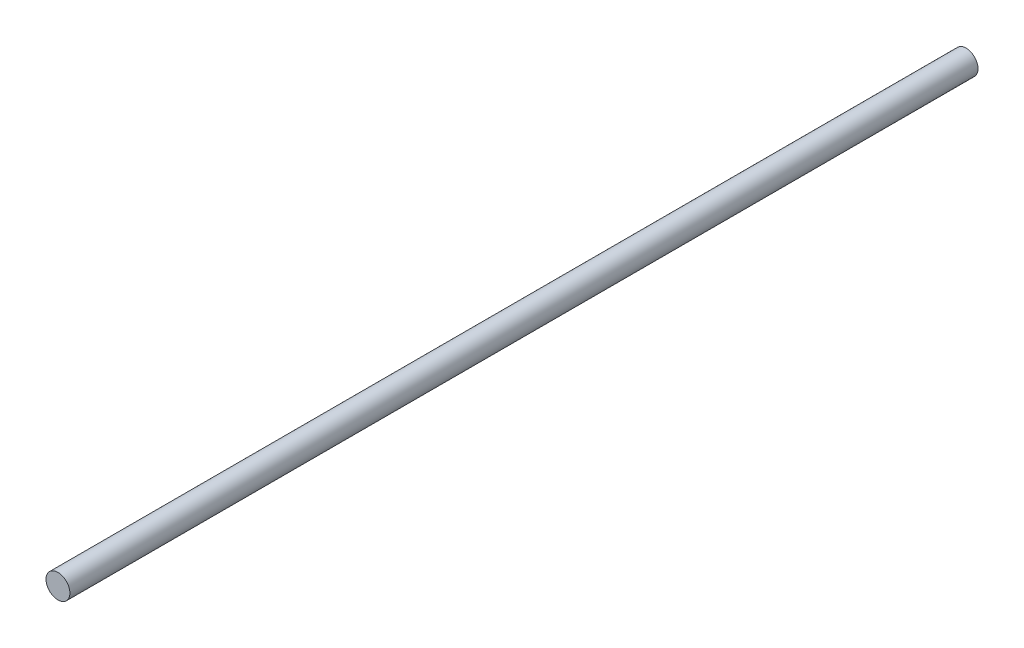
ISO-10303-21;
HEADER;
FILE_DESCRIPTION(('STEP AP214'),'2;1');
FILE_NAME('part.step','',(''),(''),'','','');
FILE_SCHEMA(('AUTOMOTIVE_DESIGN { 1 0 10303 214 1 1 1 1 }'));
ENDSEC;
DATA;
#1=APPLICATION_CONTEXT('core data for automotive mechanical design processes');
#2=APPLICATION_PROTOCOL_DEFINITION('international standard','automotive_design',2000,#1);
#3=PRODUCT_CONTEXT('',#1,'mechanical');
#4=PRODUCT('Part','Part','',(#3));
#5=PRODUCT_RELATED_PRODUCT_CATEGORY('part','',(#4));
#6=PRODUCT_DEFINITION_FORMATION('','',#4);
#7=PRODUCT_DEFINITION_CONTEXT('part definition',#1,'design');
#8=PRODUCT_DEFINITION('design','',#6,#7);
#9=PRODUCT_DEFINITION_SHAPE('','',#8);
#10=(LENGTH_UNIT() NAMED_UNIT(*) SI_UNIT(.MILLI.,.METRE.));
#11=(NAMED_UNIT(*) PLANE_ANGLE_UNIT() SI_UNIT($,.RADIAN.));
#12=(NAMED_UNIT(*) SI_UNIT($,.STERADIAN.) SOLID_ANGLE_UNIT());
#13=UNCERTAINTY_MEASURE_WITH_UNIT(LENGTH_MEASURE(1.E-05),#10,'distance_accuracy_value','');
#14=(GEOMETRIC_REPRESENTATION_CONTEXT(3) GLOBAL_UNCERTAINTY_ASSIGNED_CONTEXT((#13)) GLOBAL_UNIT_ASSIGNED_CONTEXT((#10,
#11,#12)) REPRESENTATION_CONTEXT('',''));
#15=CARTESIAN_POINT('',(0.,0.,0.));
#16=DIRECTION('',(0.,0.,1.));
#17=DIRECTION('',(1.,0.,0.));
#18=AXIS2_PLACEMENT_3D('',#15,#16,#17);
#19=CARTESIAN_POINT('',(0.,0.,241.3));
#20=DIRECTION('',(0.,0.,-1.));
#21=DIRECTION('',(-1.,0.,0.));
#22=AXIS2_PLACEMENT_3D('',#19,#20,#21);
#23=CYLINDRICAL_SURFACE('',#22,3.175);
#24=CARTESIAN_POINT('',(0.,0.,241.3));
#25=DIRECTION('',(0.,0.,1.));
#26=DIRECTION('',(1.,0.,0.));
#27=AXIS2_PLACEMENT_3D('',#24,#25,#26);
#28=CIRCLE('',#27,3.175);
#29=CARTESIAN_POINT('',(-3.175,0.,241.3));
#30=VERTEX_POINT('',#29);
#31=EDGE_CURVE('E10',#30,#30,#28,.T.);
#32=CARTESIAN_POINT('',(0.,0.,0.));
#33=DIRECTION('',(0.,0.,1.));
#34=DIRECTION('',(1.,0.,0.));
#35=AXIS2_PLACEMENT_3D('',#32,#33,#34);
#36=CIRCLE('',#35,3.175);
#37=CARTESIAN_POINT('',(-3.175,0.,0.));
#38=VERTEX_POINT('',#37);
#39=EDGE_CURVE('E34',#38,#38,#36,.T.);
#40=CARTESIAN_POINT('',(-3.175,0.,241.3));
#41=CARTESIAN_POINT('',(-3.175,0.,238.786458333333));
#42=CARTESIAN_POINT('',(-3.175,0.,236.272916666667));
#43=CARTESIAN_POINT('',(-3.175,0.,231.245833333333));
#44=CARTESIAN_POINT('',(-3.175,0.,228.732291666667));
#45=CARTESIAN_POINT('',(-3.175,0.,223.705208333333));
#46=CARTESIAN_POINT('',(-3.175,0.,221.191666666667));
#47=CARTESIAN_POINT('',(-3.175,0.,216.164583333333));
#48=CARTESIAN_POINT('',(-3.175,0.,213.651041666667));
#49=CARTESIAN_POINT('',(-3.175,0.,208.623958333333));
#50=CARTESIAN_POINT('',(-3.175,0.,206.110416666667));
#51=CARTESIAN_POINT('',(-3.175,0.,201.083333333333));
#52=CARTESIAN_POINT('',(-3.175,0.,198.569791666667));
#53=CARTESIAN_POINT('',(-3.175,0.,193.542708333333));
#54=CARTESIAN_POINT('',(-3.175,0.,191.029166666667));
#55=CARTESIAN_POINT('',(-3.175,0.,186.002083333333));
#56=CARTESIAN_POINT('',(-3.175,0.,183.488541666667));
#57=CARTESIAN_POINT('',(-3.175,0.,178.461458333333));
#58=CARTESIAN_POINT('',(-3.175,0.,175.947916666667));
#59=CARTESIAN_POINT('',(-3.175,0.,170.920833333333));
#60=CARTESIAN_POINT('',(-3.175,0.,168.407291666667));
#61=CARTESIAN_POINT('',(-3.175,0.,163.380208333333));
#62=CARTESIAN_POINT('',(-3.175,0.,160.866666666667));
#63=CARTESIAN_POINT('',(-3.175,0.,155.839583333333));
#64=CARTESIAN_POINT('',(-3.175,0.,153.326041666667));
#65=CARTESIAN_POINT('',(-3.175,0.,148.298958333333));
#66=CARTESIAN_POINT('',(-3.175,0.,145.785416666667));
#67=CARTESIAN_POINT('',(-3.175,0.,140.758333333333));
#68=CARTESIAN_POINT('',(-3.175,0.,138.244791666667));
#69=CARTESIAN_POINT('',(-3.175,0.,133.217708333333));
#70=CARTESIAN_POINT('',(-3.175,0.,130.704166666667));
#71=CARTESIAN_POINT('',(-3.175,0.,125.677083333333));
#72=CARTESIAN_POINT('',(-3.175,0.,123.163541666667));
#73=CARTESIAN_POINT('',(-3.175,0.,118.136458333333));
#74=CARTESIAN_POINT('',(-3.175,0.,115.622916666667));
#75=CARTESIAN_POINT('',(-3.175,0.,110.595833333333));
#76=CARTESIAN_POINT('',(-3.175,0.,108.082291666667));
#77=CARTESIAN_POINT('',(-3.175,0.,103.055208333333));
#78=CARTESIAN_POINT('',(-3.175,0.,100.541666666667));
#79=CARTESIAN_POINT('',(-3.175,0.,95.5145833333333));
#80=CARTESIAN_POINT('',(-3.175,0.,93.0010416666667));
#81=CARTESIAN_POINT('',(-3.175,0.,87.9739583333333));
#82=CARTESIAN_POINT('',(-3.175,0.,85.4604166666667));
#83=CARTESIAN_POINT('',(-3.175,0.,80.4333333333333));
#84=CARTESIAN_POINT('',(-3.175,0.,77.9197916666667));
#85=CARTESIAN_POINT('',(-3.175,0.,72.8927083333333));
#86=CARTESIAN_POINT('',(-3.175,0.,70.3791666666667));
#87=CARTESIAN_POINT('',(-3.175,0.,65.3520833333334));
#88=CARTESIAN_POINT('',(-3.175,0.,62.8385416666667));
#89=CARTESIAN_POINT('',(-3.175,0.,57.8114583333333));
#90=CARTESIAN_POINT('',(-3.175,0.,55.2979166666667));
#91=CARTESIAN_POINT('',(-3.175,0.,50.2708333333333));
#92=CARTESIAN_POINT('',(-3.175,0.,47.7572916666667));
#93=CARTESIAN_POINT('',(-3.175,0.,42.7302083333333));
#94=CARTESIAN_POINT('',(-3.175,0.,40.2166666666667));
#95=CARTESIAN_POINT('',(-3.175,0.,35.1895833333333));
#96=CARTESIAN_POINT('',(-3.175,0.,32.6760416666667));
#97=CARTESIAN_POINT('',(-3.175,0.,27.6489583333333));
#98=CARTESIAN_POINT('',(-3.175,0.,25.1354166666667));
#99=CARTESIAN_POINT('',(-3.175,0.,20.1083333333333));
#100=CARTESIAN_POINT('',(-3.175,0.,17.5947916666667));
#101=CARTESIAN_POINT('',(-3.175,0.,12.5677083333333));
#102=CARTESIAN_POINT('',(-3.175,0.,10.0541666666667));
#103=CARTESIAN_POINT('',(-3.175,0.,5.02708333333333));
#104=CARTESIAN_POINT('',(-3.175,0.,2.51354166666666));
#105=CARTESIAN_POINT('',(-3.175,0.,0.));
#106=B_SPLINE_CURVE_WITH_KNOTS('',3,(#40,#41,#42,#43,#44,#45,#46,#47,#48,#49,#50,#51,#52,#53,
#54,#55,#56,#57,#58,#59,#60,#61,#62,#63,#64,#65,#66,#67,#68,#69,#70,#71,#72,#73,#74,#75,#76,#77,
#78,#79,#80,#81,#82,#83,#84,#85,#86,#87,#88,#89,#90,#91,#92,#93,#94,#95,#96,#97,#98,#99,#100,
#101,#102,#103,#104,#105),.UNSPECIFIED.,.F.,.F.,(4,2,2,2,2,2,2,2,2,2,2,2,2,2,2,2,2,2,2,2,2,2,2,
2,2,2,2,2,2,2,2,2,4),(0.,7.54062500000002,15.08125,22.621875,30.1625,37.703125,45.24375,
52.784375,60.325,67.865625,75.40625,82.946875,90.4875,98.028125,105.56875,113.109375,120.65,
128.190625,135.73125,143.271875,150.8125,158.353125,165.89375,173.434375,180.975,188.515625,
196.05625,203.596875,211.1375,218.678125,226.21875,233.759375,241.3),.UNSPECIFIED.);
#107=EDGE_CURVE('BSEAM31',#30,#38,#106,.T.);
#108=ORIENTED_EDGE('',*,*,#31,.F.);
#109=ORIENTED_EDGE('',*,*,#39,.T.);
#110=ORIENTED_EDGE('',*,*,#107,.T.);
#111=ORIENTED_EDGE('',*,*,#107,.F.);
#112=EDGE_LOOP('',(#108,#110,#109,#111));
#113=FACE_BOUND('',#112,.T.);
#114=ADVANCED_FACE('F31',(#113),#23,.T.);
#115=CARTESIAN_POINT('',(0.,0.,241.3));
#116=DIRECTION('',(0.,0.,1.));
#117=DIRECTION('',(1.,0.,0.));
#118=AXIS2_PLACEMENT_3D('',#115,#116,#117);
#119=PLANE('',#118);
#120=ORIENTED_EDGE('',*,*,#31,.T.);
#121=EDGE_LOOP('',(#120));
#122=FACE_BOUND('',#121,.T.);
#123=ADVANCED_FACE('F46',(#122),#119,.T.);
#124=CARTESIAN_POINT('',(0.,0.,0.));
#125=DIRECTION('',(0.,0.,1.));
#126=DIRECTION('',(1.,0.,0.));
#127=AXIS2_PLACEMENT_3D('',#124,#125,#126);
#128=PLANE('',#127);
#129=ORIENTED_EDGE('',*,*,#39,.F.);
#130=EDGE_LOOP('',(#129));
#131=FACE_BOUND('',#130,.T.);
#132=ADVANCED_FACE('F44',(#131),#128,.F.);
#133=CLOSED_SHELL('',(#114,#123,#132));
#134=MANIFOLD_SOLID_BREP('B2',#133);
#135=ADVANCED_BREP_SHAPE_REPRESENTATION('',(#18,#134),#14);
#136=SHAPE_DEFINITION_REPRESENTATION(#9,#135);
ENDSEC;
END-ISO-10303-21;
